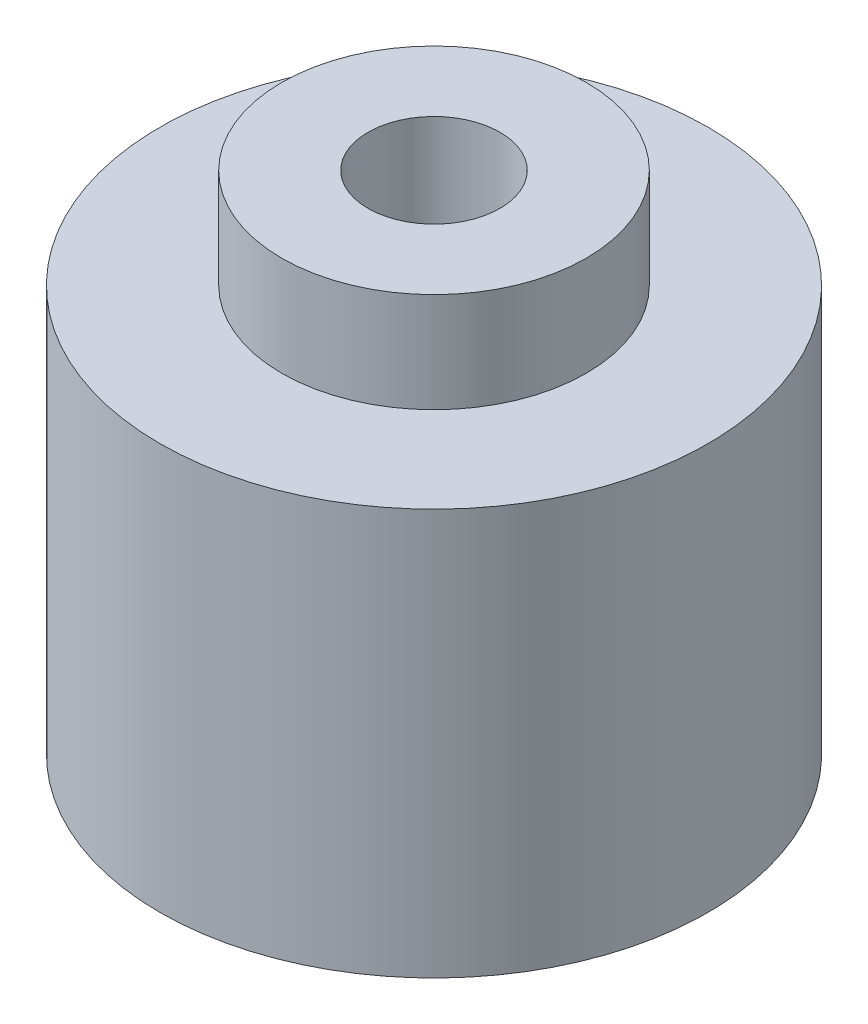
ISO-10303-21;
HEADER;
FILE_DESCRIPTION(('STEP AP214'),'2;1');
FILE_NAME('part.step','',(''),(''),'','','');
FILE_SCHEMA(('AUTOMOTIVE_DESIGN { 1 0 10303 214 1 1 1 1 }'));
ENDSEC;
DATA;
#1=APPLICATION_CONTEXT('core data for automotive mechanical design processes');
#2=APPLICATION_PROTOCOL_DEFINITION('international standard','automotive_design',2000,#1);
#3=PRODUCT_CONTEXT('',#1,'mechanical');
#4=PRODUCT('Part','Part','',(#3));
#5=PRODUCT_RELATED_PRODUCT_CATEGORY('part','',(#4));
#6=PRODUCT_DEFINITION_FORMATION('','',#4);
#7=PRODUCT_DEFINITION_CONTEXT('part definition',#1,'design');
#8=PRODUCT_DEFINITION('design','',#6,#7);
#9=PRODUCT_DEFINITION_SHAPE('','',#8);
#10=(LENGTH_UNIT() NAMED_UNIT(*) SI_UNIT(.MILLI.,.METRE.));
#11=(NAMED_UNIT(*) PLANE_ANGLE_UNIT() SI_UNIT($,.RADIAN.));
#12=(NAMED_UNIT(*) SI_UNIT($,.STERADIAN.) SOLID_ANGLE_UNIT());
#13=UNCERTAINTY_MEASURE_WITH_UNIT(LENGTH_MEASURE(1.E-05),#10,'distance_accuracy_value','');
#14=(GEOMETRIC_REPRESENTATION_CONTEXT(3) GLOBAL_UNCERTAINTY_ASSIGNED_CONTEXT((#13)) GLOBAL_UNIT_ASSIGNED_CONTEXT((#10,
#11,#12)) REPRESENTATION_CONTEXT('',''));
#15=CARTESIAN_POINT('',(0.,0.,0.));
#16=DIRECTION('',(0.,0.,1.));
#17=DIRECTION('',(1.,0.,0.));
#18=AXIS2_PLACEMENT_3D('',#15,#16,#17);
#19=CARTESIAN_POINT('',(0.,40.,0.));
#20=DIRECTION('',(0.,-1.,0.));
#21=DIRECTION('',(0.,0.,-1.));
#22=AXIS2_PLACEMENT_3D('',#19,#20,#21);
#23=CYLINDRICAL_SURFACE('',#22,27.);
#24=CARTESIAN_POINT('',(0.,40.,0.));
#25=DIRECTION('',(0.,1.,0.));
#26=DIRECTION('',(0.,0.,1.));
#27=AXIS2_PLACEMENT_3D('',#24,#25,#26);
#28=CIRCLE('',#27,27.);
#29=CARTESIAN_POINT('',(0.,40.,27.));
#30=VERTEX_POINT('',#29);
#31=EDGE_CURVE('E54',#30,#30,#28,.T.);
#32=ORIENTED_EDGE('',*,*,#31,.F.);
#33=EDGE_LOOP('',(#32));
#34=FACE_BOUND('',#33,.T.);
#35=CARTESIAN_POINT('',(0.,0.,0.));
#36=DIRECTION('',(0.,1.,0.));
#37=DIRECTION('',(0.,0.,1.));
#38=AXIS2_PLACEMENT_3D('',#35,#36,#37);
#39=CIRCLE('',#38,27.);
#40=CARTESIAN_POINT('',(0.,0.,27.));
#41=VERTEX_POINT('',#40);
#42=EDGE_CURVE('E50',#41,#41,#39,.T.);
#43=ORIENTED_EDGE('',*,*,#42,.T.);
#44=EDGE_LOOP('',(#43));
#45=FACE_BOUND('',#44,.T.);
#46=ADVANCED_FACE('F47',(#34,#45),#23,.T.);
#47=CARTESIAN_POINT('',(0.,40.,0.));
#48=DIRECTION('',(0.,1.,0.));
#49=DIRECTION('',(0.,0.,1.));
#50=AXIS2_PLACEMENT_3D('',#47,#48,#49);
#51=PLANE('',#50);
#52=CARTESIAN_POINT('',(0.,40.,0.));
#53=DIRECTION('',(0.,1.,0.));
#54=DIRECTION('',(0.,0.,1.));
#55=AXIS2_PLACEMENT_3D('',#52,#53,#54);
#56=CIRCLE('',#55,15.);
#57=CARTESIAN_POINT('',(0.,40.,15.));
#58=VERTEX_POINT('',#57);
#59=EDGE_CURVE('E10',#58,#58,#56,.T.);
#60=ORIENTED_EDGE('',*,*,#59,.F.);
#61=EDGE_LOOP('',(#60));
#62=FACE_BOUND('',#61,.T.);
#63=ORIENTED_EDGE('',*,*,#31,.T.);
#64=EDGE_LOOP('',(#63));
#65=FACE_BOUND('',#64,.T.);
#66=ADVANCED_FACE('F88',(#62,#65),#51,.T.);
#67=CARTESIAN_POINT('',(0.,0.,0.));
#68=DIRECTION('',(0.,1.,0.));
#69=DIRECTION('',(0.,0.,1.));
#70=AXIS2_PLACEMENT_3D('',#67,#68,#69);
#71=PLANE('',#70);
#72=CARTESIAN_POINT('',(0.,0.,0.));
#73=DIRECTION('',(0.,1.,0.));
#74=DIRECTION('',(0.,0.,1.));
#75=AXIS2_PLACEMENT_3D('',#72,#73,#74);
#76=CIRCLE('',#75,6.5);
#77=CARTESIAN_POINT('',(0.,0.,6.5));
#78=VERTEX_POINT('',#77);
#79=EDGE_CURVE('E63',#78,#78,#76,.T.);
#80=ORIENTED_EDGE('',*,*,#79,.T.);
#81=EDGE_LOOP('',(#80));
#82=FACE_BOUND('',#81,.T.);
#83=ORIENTED_EDGE('',*,*,#42,.F.);
#84=EDGE_LOOP('',(#83));
#85=FACE_BOUND('',#84,.T.);
#86=ADVANCED_FACE('F81',(#82,#85),#71,.F.);
#87=CARTESIAN_POINT('',(0.,49.8189262424532,0.));
#88=DIRECTION('',(0.,-1.,0.));
#89=DIRECTION('',(0.,0.,-1.));
#90=AXIS2_PLACEMENT_3D('',#87,#88,#89);
#91=CYLINDRICAL_SURFACE('',#90,15.);
#92=CARTESIAN_POINT('',(0.,49.8189262424532,0.));
#93=DIRECTION('',(0.,1.,0.));
#94=DIRECTION('',(0.,0.,1.));
#95=AXIS2_PLACEMENT_3D('',#92,#93,#94);
#96=CIRCLE('',#95,15.);
#97=CARTESIAN_POINT('',(0.,49.8189262424532,15.));
#98=VERTEX_POINT('',#97);
#99=EDGE_CURVE('E60',#98,#98,#96,.T.);
#100=ORIENTED_EDGE('',*,*,#99,.F.);
#101=EDGE_LOOP('',(#100));
#102=FACE_BOUND('',#101,.T.);
#103=ORIENTED_EDGE('',*,*,#59,.T.);
#104=EDGE_LOOP('',(#103));
#105=FACE_BOUND('',#104,.T.);
#106=ADVANCED_FACE('F76',(#102,#105),#91,.T.);
#107=CARTESIAN_POINT('',(0.,49.8189262424532,0.));
#108=DIRECTION('',(0.,1.,0.));
#109=DIRECTION('',(0.,0.,1.));
#110=AXIS2_PLACEMENT_3D('',#107,#108,#109);
#111=PLANE('',#110);
#112=CARTESIAN_POINT('',(0.,49.8189262424532,0.));
#113=DIRECTION('',(0.,1.,0.));
#114=DIRECTION('',(0.,0.,1.));
#115=AXIS2_PLACEMENT_3D('',#112,#113,#114);
#116=CIRCLE('',#115,6.5);
#117=CARTESIAN_POINT('',(0.,49.8189262424532,6.5));
#118=VERTEX_POINT('',#117);
#119=EDGE_CURVE('E66',#118,#118,#116,.T.);
#120=ORIENTED_EDGE('',*,*,#119,.F.);
#121=EDGE_LOOP('',(#120));
#122=FACE_BOUND('',#121,.T.);
#123=ORIENTED_EDGE('',*,*,#99,.T.);
#124=EDGE_LOOP('',(#123));
#125=FACE_BOUND('',#124,.T.);
#126=ADVANCED_FACE('F73',(#122,#125),#111,.T.);
#127=CARTESIAN_POINT('',(0.,-5.30022075941561,0.));
#128=DIRECTION('',(0.,1.,0.));
#129=DIRECTION('',(0.,0.,1.));
#130=AXIS2_PLACEMENT_3D('',#127,#128,#129);
#131=CYLINDRICAL_SURFACE('',#130,6.5);
#132=ORIENTED_EDGE('',*,*,#119,.T.);
#133=EDGE_LOOP('',(#132));
#134=FACE_BOUND('',#133,.T.);
#135=ORIENTED_EDGE('',*,*,#79,.F.);
#136=EDGE_LOOP('',(#135));
#137=FACE_BOUND('',#136,.T.);
#138=ADVANCED_FACE('F70',(#134,#137),#131,.F.);
#139=CLOSED_SHELL('',(#46,#66,#86,#106,#126,#138));
#140=MANIFOLD_SOLID_BREP('B2',#139);
#141=ADVANCED_BREP_SHAPE_REPRESENTATION('',(#18,#140),#14);
#142=SHAPE_DEFINITION_REPRESENTATION(#9,#141);
ENDSEC;
END-ISO-10303-21;
